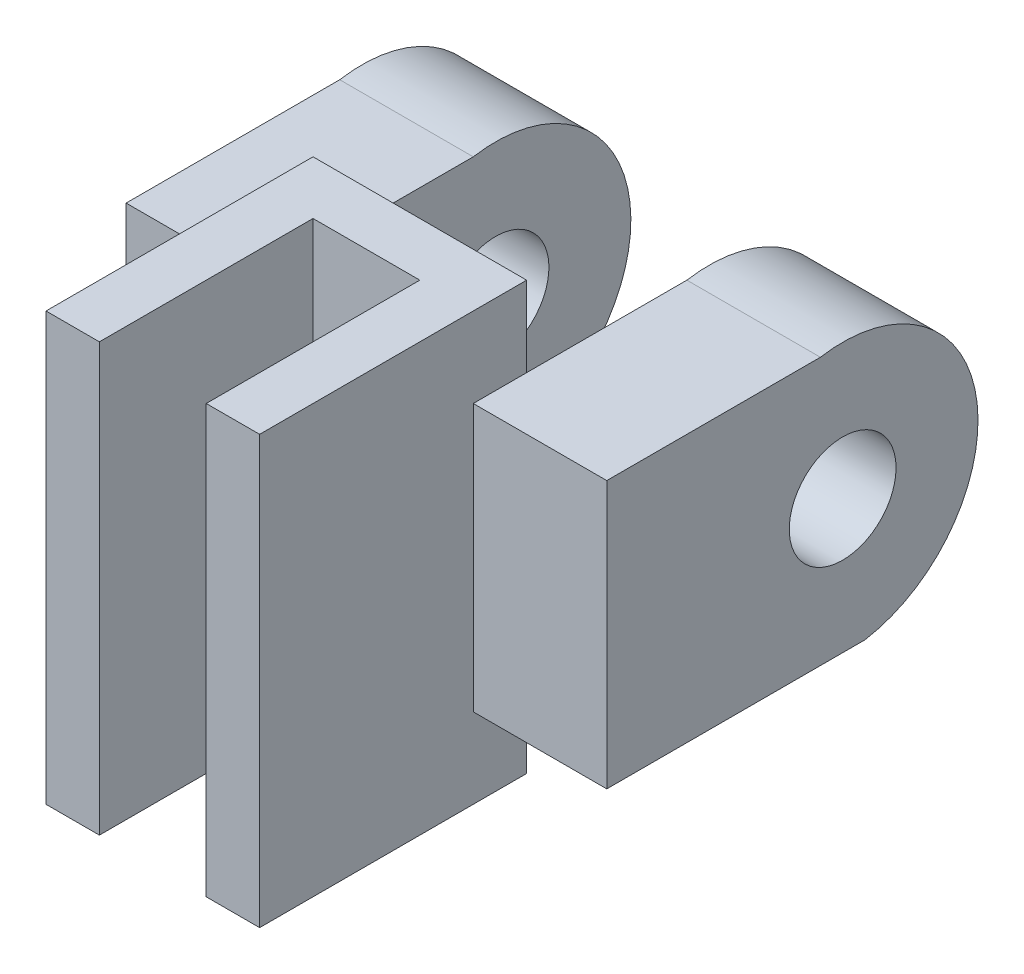
ISO-10303-21;
HEADER;
FILE_DESCRIPTION(('STEP AP214'),'2;1');
FILE_NAME('part.step','',(''),(''),'','','');
FILE_SCHEMA(('AUTOMOTIVE_DESIGN { 1 0 10303 214 1 1 1 1 }'));
ENDSEC;
DATA;
#1=APPLICATION_CONTEXT('core data for automotive mechanical design processes');
#2=APPLICATION_PROTOCOL_DEFINITION('international standard','automotive_design',2000,#1);
#3=PRODUCT_CONTEXT('',#1,'mechanical');
#4=PRODUCT('Part','Part','',(#3));
#5=PRODUCT_RELATED_PRODUCT_CATEGORY('part','',(#4));
#6=PRODUCT_DEFINITION_FORMATION('','',#4);
#7=PRODUCT_DEFINITION_CONTEXT('part definition',#1,'design');
#8=PRODUCT_DEFINITION('design','',#6,#7);
#9=PRODUCT_DEFINITION_SHAPE('','',#8);
#10=(LENGTH_UNIT() NAMED_UNIT(*) SI_UNIT(.MILLI.,.METRE.));
#11=(NAMED_UNIT(*) PLANE_ANGLE_UNIT() SI_UNIT($,.RADIAN.));
#12=(NAMED_UNIT(*) SI_UNIT($,.STERADIAN.) SOLID_ANGLE_UNIT());
#13=UNCERTAINTY_MEASURE_WITH_UNIT(LENGTH_MEASURE(1.E-05),#10,'distance_accuracy_value','');
#14=(GEOMETRIC_REPRESENTATION_CONTEXT(3) GLOBAL_UNCERTAINTY_ASSIGNED_CONTEXT((#13)) GLOBAL_UNIT_ASSIGNED_CONTEXT((#10,
#11,#12)) REPRESENTATION_CONTEXT('',''));
#15=CARTESIAN_POINT('',(0.,0.,0.));
#16=DIRECTION('',(0.,0.,1.));
#17=DIRECTION('',(1.,0.,0.));
#18=AXIS2_PLACEMENT_3D('',#15,#16,#17);
#19=CARTESIAN_POINT('',(2.,-2.5,3.));
#20=DIRECTION('',(0.,1.,0.));
#21=DIRECTION('',(-1.,0.,0.));
#22=AXIS2_PLACEMENT_3D('',#19,#20,#21);
#23=PLANE('',#22);
#24=DIRECTION('',(-1.,0.,0.));
#25=VECTOR('',#24,1.);
#26=CARTESIAN_POINT('',(4.5,-2.5,1.));
#27=LINE('',#26,#25);
#28=CARTESIAN_POINT('',(4.5,-2.5,1.));
#29=VERTEX_POINT('',#28);
#30=CARTESIAN_POINT('',(2.,-2.5,1.));
#31=VERTEX_POINT('',#30);
#32=EDGE_CURVE('E308',#29,#31,#27,.T.);
#33=ORIENTED_EDGE('',*,*,#32,.T.);
#34=DIRECTION('',(0.,0.,-1.));
#35=VECTOR('',#34,1.);
#36=CARTESIAN_POINT('',(2.,-2.5,3.));
#37=LINE('',#36,#35);
#38=CARTESIAN_POINT('',(2.,-2.5,0.));
#39=VERTEX_POINT('',#38);
#40=EDGE_CURVE('E242',#31,#39,#37,.T.);
#41=ORIENTED_EDGE('',*,*,#40,.T.);
#42=DIRECTION('',(0.,0.,1.));
#43=VECTOR('',#42,1.);
#44=CARTESIAN_POINT('',(2.,-2.5,0.));
#45=LINE('',#44,#43);
#46=CARTESIAN_POINT('',(2.,-2.5,-3.8334141689622));
#47=VERTEX_POINT('',#46);
#48=EDGE_CURVE('E245',#47,#39,#45,.T.);
#49=ORIENTED_EDGE('',*,*,#48,.F.);
#50=DIRECTION('',(1.,0.,0.));
#51=VECTOR('',#50,1.);
#52=CARTESIAN_POINT('',(0.999999999999999,-2.5,-3.8334141689622));
#53=LINE('',#52,#51);
#54=CARTESIAN_POINT('',(4.5,-2.5,-3.8334141689622));
#55=VERTEX_POINT('',#54);
#56=EDGE_CURVE('E260',#47,#55,#53,.T.);
#57=ORIENTED_EDGE('',*,*,#56,.T.);
#58=DIRECTION('',(0.,0.,1.));
#59=VECTOR('',#58,1.);
#60=CARTESIAN_POINT('',(4.5,-2.5,0.));
#61=LINE('',#60,#59);
#62=EDGE_CURVE('E293',#55,#29,#61,.T.);
#63=ORIENTED_EDGE('',*,*,#62,.T.);
#64=EDGE_LOOP('',(#33,#41,#49,#57,#63));
#65=FACE_BOUND('',#64,.T.);
#66=ADVANCED_FACE('F33',(#65),#23,.F.);
#67=CARTESIAN_POINT('',(2.,2.5,3.));
#68=DIRECTION('',(0.,-1.,0.));
#69=DIRECTION('',(0.,0.,-1.));
#70=AXIS2_PLACEMENT_3D('',#67,#68,#69);
#71=PLANE('',#70);
#72=DIRECTION('',(0.,0.,1.));
#73=VECTOR('',#72,1.);
#74=CARTESIAN_POINT('',(2.,2.5,3.));
#75=LINE('',#74,#73);
#76=CARTESIAN_POINT('',(2.,2.5,-3.));
#77=VERTEX_POINT('',#76);
#78=CARTESIAN_POINT('',(2.,2.5,0.));
#79=VERTEX_POINT('',#78);
#80=EDGE_CURVE('E252',#77,#79,#75,.T.);
#81=ORIENTED_EDGE('',*,*,#80,.T.);
#82=DIRECTION('',(0.,0.,1.));
#83=VECTOR('',#82,1.);
#84=CARTESIAN_POINT('',(2.,2.5,3.));
#85=LINE('',#84,#83);
#86=CARTESIAN_POINT('',(2.,2.5,0.999999999999999));
#87=VERTEX_POINT('',#86);
#88=EDGE_CURVE('E243',#79,#87,#85,.T.);
#89=ORIENTED_EDGE('',*,*,#88,.T.);
#90=DIRECTION('',(-1.,0.,0.));
#91=VECTOR('',#90,1.);
#92=CARTESIAN_POINT('',(4.5,2.5,1.));
#93=LINE('',#92,#91);
#94=CARTESIAN_POINT('',(4.5,2.5,1.));
#95=VERTEX_POINT('',#94);
#96=EDGE_CURVE('E300',#95,#87,#93,.T.);
#97=ORIENTED_EDGE('',*,*,#96,.F.);
#98=DIRECTION('',(0.,0.,1.));
#99=VECTOR('',#98,1.);
#100=CARTESIAN_POINT('',(4.5,2.5,0.));
#101=LINE('',#100,#99);
#102=CARTESIAN_POINT('',(4.5,2.5,-3.));
#103=VERTEX_POINT('',#102);
#104=EDGE_CURVE('E295',#103,#95,#101,.T.);
#105=ORIENTED_EDGE('',*,*,#104,.F.);
#106=DIRECTION('',(1.,0.,0.));
#107=VECTOR('',#106,1.);
#108=CARTESIAN_POINT('',(0.999999999999999,2.5,-3.));
#109=LINE('',#108,#107);
#110=EDGE_CURVE('E261',#77,#103,#109,.T.);
#111=ORIENTED_EDGE('',*,*,#110,.F.);
#112=EDGE_LOOP('',(#81,#89,#97,#105,#111));
#113=FACE_BOUND('',#112,.T.);
#114=ADVANCED_FACE('F371',(#113),#71,.F.);
#115=CARTESIAN_POINT('',(0.,0.,0.));
#116=DIRECTION('',(0.,0.,-1.));
#117=DIRECTION('',(-1.,0.,0.));
#118=AXIS2_PLACEMENT_3D('',#115,#116,#117);
#119=PLANE('',#118);
#120=DIRECTION('',(0.,-1.,0.));
#121=VECTOR('',#120,1.);
#122=CARTESIAN_POINT('',(-2.,2.5,0.));
#123=LINE('',#122,#121);
#124=CARTESIAN_POINT('',(-2.,2.5,0.));
#125=VERTEX_POINT('',#124);
#126=CARTESIAN_POINT('',(-2.,-2.5,0.));
#127=VERTEX_POINT('',#126);
#128=EDGE_CURVE('E273',#125,#127,#123,.T.);
#129=ORIENTED_EDGE('',*,*,#128,.F.);
#130=DIRECTION('',(0.,1.,0.));
#131=VECTOR('',#130,1.);
#132=CARTESIAN_POINT('',(-2.,-4.,0.));
#133=LINE('',#132,#131);
#134=CARTESIAN_POINT('',(-2.,4.,0.));
#135=VERTEX_POINT('',#134);
#136=EDGE_CURVE('E234',#125,#135,#133,.T.);
#137=ORIENTED_EDGE('',*,*,#136,.T.);
#138=DIRECTION('',(-1.,0.,0.));
#139=VECTOR('',#138,1.);
#140=CARTESIAN_POINT('',(2.,4.,0.));
#141=LINE('',#140,#139);
#142=CARTESIAN_POINT('',(2.,4.,0.));
#143=VERTEX_POINT('',#142);
#144=EDGE_CURVE('E208',#143,#135,#141,.T.);
#145=ORIENTED_EDGE('',*,*,#144,.F.);
#146=DIRECTION('',(0.,1.,0.));
#147=VECTOR('',#146,1.);
#148=CARTESIAN_POINT('',(2.,-4.,0.));
#149=LINE('',#148,#147);
#150=EDGE_CURVE('E231',#79,#143,#149,.T.);
#151=ORIENTED_EDGE('',*,*,#150,.F.);
#152=DIRECTION('',(0.,1.,0.));
#153=VECTOR('',#152,1.);
#154=CARTESIAN_POINT('',(2.,2.5,0.));
#155=LINE('',#154,#153);
#156=EDGE_CURVE('E48',#39,#79,#155,.T.);
#157=ORIENTED_EDGE('',*,*,#156,.F.);
#158=CARTESIAN_POINT('',(2.,-4.,0.));
#159=VERTEX_POINT('',#158);
#160=EDGE_CURVE('E235',#159,#39,#149,.T.);
#161=ORIENTED_EDGE('',*,*,#160,.F.);
#162=DIRECTION('',(-1.,0.,0.));
#163=VECTOR('',#162,1.);
#164=CARTESIAN_POINT('',(2.,-4.,0.));
#165=LINE('',#164,#163);
#166=CARTESIAN_POINT('',(-2.,-4.,0.));
#167=VERTEX_POINT('',#166);
#168=EDGE_CURVE('E173',#159,#167,#165,.T.);
#169=ORIENTED_EDGE('',*,*,#168,.T.);
#170=EDGE_CURVE('E168',#167,#127,#133,.T.);
#171=ORIENTED_EDGE('',*,*,#170,.T.);
#172=EDGE_LOOP('',(#129,#137,#145,#151,#157,#161,#169,#171));
#173=FACE_BOUND('',#172,.T.);
#174=ADVANCED_FACE('F332',(#173),#119,.T.);
#175=CARTESIAN_POINT('',(-2.,2.5,3.));
#176=DIRECTION('',(1.,0.,0.));
#177=DIRECTION('',(0.,1.,0.));
#178=AXIS2_PLACEMENT_3D('',#175,#176,#177);
#179=PLANE('',#178);
#180=DIRECTION('',(0.,0.,1.));
#181=VECTOR('',#180,1.);
#182=CARTESIAN_POINT('',(-2.,-4.,0.));
#183=LINE('',#182,#181);
#184=CARTESIAN_POINT('',(-2.,-4.,5.));
#185=VERTEX_POINT('',#184);
#186=EDGE_CURVE('E160',#167,#185,#183,.T.);
#187=ORIENTED_EDGE('',*,*,#186,.T.);
#188=DIRECTION('',(0.,-1.,0.));
#189=VECTOR('',#188,1.);
#190=CARTESIAN_POINT('',(-2.,4.,5.));
#191=LINE('',#190,#189);
#192=CARTESIAN_POINT('',(-2.,4.,5.));
#193=VERTEX_POINT('',#192);
#194=EDGE_CURVE('E165',#193,#185,#191,.T.);
#195=ORIENTED_EDGE('',*,*,#194,.F.);
#196=DIRECTION('',(0.,0.,1.));
#197=VECTOR('',#196,1.);
#198=CARTESIAN_POINT('',(-2.,4.,0.));
#199=LINE('',#198,#197);
#200=EDGE_CURVE('E211',#135,#193,#199,.T.);
#201=ORIENTED_EDGE('',*,*,#200,.F.);
#202=ORIENTED_EDGE('',*,*,#136,.F.);
#203=DIRECTION('',(0.,0.,-1.));
#204=VECTOR('',#203,1.);
#205=CARTESIAN_POINT('',(-2.,2.5,3.));
#206=LINE('',#205,#204);
#207=CARTESIAN_POINT('',(-2.,2.5,0.999999999999999));
#208=VERTEX_POINT('',#207);
#209=EDGE_CURVE('E233',#208,#125,#206,.T.);
#210=ORIENTED_EDGE('',*,*,#209,.F.);
#211=DIRECTION('',(0.,-1.,0.));
#212=VECTOR('',#211,1.);
#213=CARTESIAN_POINT('',(-2.,2.5,0.999999999999999));
#214=LINE('',#213,#212);
#215=CARTESIAN_POINT('',(-2.,-2.5,0.999999999999999));
#216=VERTEX_POINT('',#215);
#217=EDGE_CURVE('E316',#208,#216,#214,.T.);
#218=ORIENTED_EDGE('',*,*,#217,.T.);
#219=DIRECTION('',(0.,0.,1.));
#220=VECTOR('',#219,1.);
#221=CARTESIAN_POINT('',(-2.,-2.5,3.));
#222=LINE('',#221,#220);
#223=EDGE_CURVE('E240',#127,#216,#222,.T.);
#224=ORIENTED_EDGE('',*,*,#223,.F.);
#225=ORIENTED_EDGE('',*,*,#170,.F.);
#226=EDGE_LOOP('',(#187,#195,#201,#202,#210,#218,#224,#225));
#227=FACE_BOUND('',#226,.T.);
#228=ADVANCED_FACE('F162',(#227),#179,.F.);
#229=DIRECTION('',(0.,0.,-1.));
#230=VECTOR('',#229,1.);
#231=CARTESIAN_POINT('',(-2.,-2.5,0.));
#232=LINE('',#231,#230);
#233=CARTESIAN_POINT('',(-2.,-2.5,-3.8334141689622));
#234=VERTEX_POINT('',#233);
#235=EDGE_CURVE('E290',#127,#234,#232,.T.);
#236=ORIENTED_EDGE('',*,*,#235,.F.);
#237=ORIENTED_EDGE('',*,*,#223,.T.);
#238=CARTESIAN_POINT('',(-4.5,-2.5,0.999999999999999));
#239=VERTEX_POINT('',#238);
#240=EDGE_CURVE('E307',#216,#239,#27,.T.);
#241=ORIENTED_EDGE('',*,*,#240,.T.);
#242=DIRECTION('',(0.,0.,-1.));
#243=VECTOR('',#242,1.);
#244=CARTESIAN_POINT('',(-4.5,-2.5,0.));
#245=LINE('',#244,#243);
#246=CARTESIAN_POINT('',(-4.5,-2.5,-3.8334141689622));
#247=VERTEX_POINT('',#246);
#248=EDGE_CURVE('E299',#239,#247,#245,.T.);
#249=ORIENTED_EDGE('',*,*,#248,.T.);
#250=DIRECTION('',(-1.,0.,0.));
#251=VECTOR('',#250,1.);
#252=CARTESIAN_POINT('',(-0.999999999999999,-2.5,-3.8334141689622));
#253=LINE('',#252,#251);
#254=EDGE_CURVE('E279',#234,#247,#253,.T.);
#255=ORIENTED_EDGE('',*,*,#254,.F.);
#256=EDGE_LOOP('',(#236,#237,#241,#249,#255));
#257=FACE_BOUND('',#256,.T.);
#258=ADVANCED_FACE('F35',(#257),#23,.F.);
#259=CARTESIAN_POINT('',(2.,2.5,3.));
#260=DIRECTION('',(-1.,0.,0.));
#261=DIRECTION('',(0.,0.,1.));
#262=AXIS2_PLACEMENT_3D('',#259,#260,#261);
#263=PLANE('',#262);
#264=DIRECTION('',(0.,0.,-1.));
#265=VECTOR('',#264,1.);
#266=CARTESIAN_POINT('',(2.,4.,0.));
#267=LINE('',#266,#265);
#268=CARTESIAN_POINT('',(2.,4.,5.));
#269=VERTEX_POINT('',#268);
#270=EDGE_CURVE('E205',#269,#143,#267,.T.);
#271=ORIENTED_EDGE('',*,*,#270,.F.);
#272=DIRECTION('',(0.,1.,0.));
#273=VECTOR('',#272,1.);
#274=CARTESIAN_POINT('',(2.,-4.,5.));
#275=LINE('',#274,#273);
#276=CARTESIAN_POINT('',(2.,-4.,5.));
#277=VERTEX_POINT('',#276);
#278=EDGE_CURVE('E199',#277,#269,#275,.T.);
#279=ORIENTED_EDGE('',*,*,#278,.F.);
#280=DIRECTION('',(0.,0.,-1.));
#281=VECTOR('',#280,1.);
#282=CARTESIAN_POINT('',(2.,-4.,0.));
#283=LINE('',#282,#281);
#284=EDGE_CURVE('E221',#277,#159,#283,.T.);
#285=ORIENTED_EDGE('',*,*,#284,.T.);
#286=ORIENTED_EDGE('',*,*,#160,.T.);
#287=ORIENTED_EDGE('',*,*,#40,.F.);
#288=DIRECTION('',(0.,1.,0.));
#289=VECTOR('',#288,1.);
#290=CARTESIAN_POINT('',(2.,2.5,1.));
#291=LINE('',#290,#289);
#292=EDGE_CURVE('E56',#31,#87,#291,.T.);
#293=ORIENTED_EDGE('',*,*,#292,.T.);
#294=ORIENTED_EDGE('',*,*,#88,.F.);
#295=ORIENTED_EDGE('',*,*,#150,.T.);
#296=EDGE_LOOP('',(#271,#279,#285,#286,#287,#293,#294,#295));
#297=FACE_BOUND('',#296,.T.);
#298=ADVANCED_FACE('F378',(#297),#263,.F.);
#299=CARTESIAN_POINT('',(-4.5,2.5,0.999999999999999));
#300=VERTEX_POINT('',#299);
#301=EDGE_CURVE('E298',#208,#300,#93,.T.);
#302=ORIENTED_EDGE('',*,*,#301,.F.);
#303=ORIENTED_EDGE('',*,*,#209,.T.);
#304=DIRECTION('',(0.,0.,-1.));
#305=VECTOR('',#304,1.);
#306=CARTESIAN_POINT('',(-2.,2.5,3.));
#307=LINE('',#306,#305);
#308=CARTESIAN_POINT('',(-2.,2.5,-3.));
#309=VERTEX_POINT('',#308);
#310=EDGE_CURVE('E278',#125,#309,#307,.T.);
#311=ORIENTED_EDGE('',*,*,#310,.T.);
#312=DIRECTION('',(-1.,0.,0.));
#313=VECTOR('',#312,1.);
#314=CARTESIAN_POINT('',(-0.999999999999999,2.5,-3.));
#315=LINE('',#314,#313);
#316=CARTESIAN_POINT('',(-4.5,2.5,-3.));
#317=VERTEX_POINT('',#316);
#318=EDGE_CURVE('E275',#309,#317,#315,.T.);
#319=ORIENTED_EDGE('',*,*,#318,.T.);
#320=DIRECTION('',(0.,0.,-1.));
#321=VECTOR('',#320,1.);
#322=CARTESIAN_POINT('',(-4.5,2.5,0.));
#323=LINE('',#322,#321);
#324=EDGE_CURVE('E302',#300,#317,#323,.T.);
#325=ORIENTED_EDGE('',*,*,#324,.F.);
#326=EDGE_LOOP('',(#302,#303,#311,#319,#325));
#327=FACE_BOUND('',#326,.T.);
#328=ADVANCED_FACE('F338',(#327),#71,.F.);
#329=CARTESIAN_POINT('',(-1.,2.5,1.));
#330=DIRECTION('',(-1.,0.,0.));
#331=DIRECTION('',(0.,0.,1.));
#332=AXIS2_PLACEMENT_3D('',#329,#330,#331);
#333=PLANE('',#332);
#334=DIRECTION('',(0.,0.,-1.));
#335=VECTOR('',#334,1.);
#336=CARTESIAN_POINT('',(-1.,4.,3.));
#337=LINE('',#336,#335);
#338=CARTESIAN_POINT('',(-1.,4.,5.));
#339=VERTEX_POINT('',#338);
#340=CARTESIAN_POINT('',(-1.,4.,1.));
#341=VERTEX_POINT('',#340);
#342=EDGE_CURVE('E213',#339,#341,#337,.T.);
#343=ORIENTED_EDGE('',*,*,#342,.F.);
#344=DIRECTION('',(0.,1.,0.));
#345=VECTOR('',#344,1.);
#346=CARTESIAN_POINT('',(-1.,4.,5.));
#347=LINE('',#346,#345);
#348=CARTESIAN_POINT('',(-1.,-4.,5.));
#349=VERTEX_POINT('',#348);
#350=EDGE_CURVE('E183',#349,#339,#347,.T.);
#351=ORIENTED_EDGE('',*,*,#350,.F.);
#352=DIRECTION('',(0.,0.,-1.));
#353=VECTOR('',#352,1.);
#354=CARTESIAN_POINT('',(-1.,-4.,3.));
#355=LINE('',#354,#353);
#356=CARTESIAN_POINT('',(-1.,-4.,1.));
#357=VERTEX_POINT('',#356);
#358=EDGE_CURVE('E172',#349,#357,#355,.T.);
#359=ORIENTED_EDGE('',*,*,#358,.T.);
#360=DIRECTION('',(0.,-1.,0.));
#361=VECTOR('',#360,1.);
#362=CARTESIAN_POINT('',(-1.,2.5,1.));
#363=LINE('',#362,#361);
#364=EDGE_CURVE('E37',#341,#357,#363,.T.);
#365=ORIENTED_EDGE('',*,*,#364,.F.);
#366=EDGE_LOOP('',(#343,#351,#359,#365));
#367=FACE_BOUND('',#366,.T.);
#368=ADVANCED_FACE('F325',(#367),#333,.F.);
#369=CARTESIAN_POINT('',(1.,2.5,1.));
#370=DIRECTION('',(1.,0.,0.));
#371=DIRECTION('',(0.,0.,-1.));
#372=AXIS2_PLACEMENT_3D('',#369,#370,#371);
#373=PLANE('',#372);
#374=DIRECTION('',(0.,0.,1.));
#375=VECTOR('',#374,1.);
#376=CARTESIAN_POINT('',(1.,-4.,1.));
#377=LINE('',#376,#375);
#378=CARTESIAN_POINT('',(1.,-4.,1.));
#379=VERTEX_POINT('',#378);
#380=CARTESIAN_POINT('',(1.,-4.,5.));
#381=VERTEX_POINT('',#380);
#382=EDGE_CURVE('E229',#379,#381,#377,.T.);
#383=ORIENTED_EDGE('',*,*,#382,.T.);
#384=DIRECTION('',(0.,-1.,0.));
#385=VECTOR('',#384,1.);
#386=CARTESIAN_POINT('',(1.,-4.,5.));
#387=LINE('',#386,#385);
#388=CARTESIAN_POINT('',(1.,4.,5.));
#389=VERTEX_POINT('',#388);
#390=EDGE_CURVE('E193',#389,#381,#387,.T.);
#391=ORIENTED_EDGE('',*,*,#390,.F.);
#392=DIRECTION('',(0.,0.,1.));
#393=VECTOR('',#392,1.);
#394=CARTESIAN_POINT('',(1.,4.,1.));
#395=LINE('',#394,#393);
#396=CARTESIAN_POINT('',(1.,4.,1.));
#397=VERTEX_POINT('',#396);
#398=EDGE_CURVE('E219',#397,#389,#395,.T.);
#399=ORIENTED_EDGE('',*,*,#398,.F.);
#400=DIRECTION('',(0.,1.,0.));
#401=VECTOR('',#400,1.);
#402=CARTESIAN_POINT('',(1.,2.5,1.));
#403=LINE('',#402,#401);
#404=EDGE_CURVE('E11',#379,#397,#403,.T.);
#405=ORIENTED_EDGE('',*,*,#404,.F.);
#406=EDGE_LOOP('',(#383,#391,#399,#405));
#407=FACE_BOUND('',#406,.T.);
#408=ADVANCED_FACE('F396',(#407),#373,.F.);
#409=CARTESIAN_POINT('',(0.,0.,1.));
#410=DIRECTION('',(0.,0.,-1.));
#411=DIRECTION('',(-1.,0.,0.));
#412=AXIS2_PLACEMENT_3D('',#409,#410,#411);
#413=PLANE('',#412);
#414=ORIENTED_EDGE('',*,*,#364,.T.);
#415=DIRECTION('',(1.,0.,0.));
#416=VECTOR('',#415,1.);
#417=CARTESIAN_POINT('',(-1.,-4.,1.));
#418=LINE('',#417,#416);
#419=EDGE_CURVE('E226',#357,#379,#418,.T.);
#420=ORIENTED_EDGE('',*,*,#419,.T.);
#421=ORIENTED_EDGE('',*,*,#404,.T.);
#422=DIRECTION('',(1.,0.,0.));
#423=VECTOR('',#422,1.);
#424=CARTESIAN_POINT('',(-1.,4.,1.));
#425=LINE('',#424,#423);
#426=EDGE_CURVE('E216',#341,#397,#425,.T.);
#427=ORIENTED_EDGE('',*,*,#426,.F.);
#428=EDGE_LOOP('',(#414,#420,#421,#427));
#429=FACE_BOUND('',#428,.T.);
#430=ADVANCED_FACE('F321',(#429),#413,.F.);
#431=CARTESIAN_POINT('',(4.5,2.5,0.));
#432=DIRECTION('',(1.,0.,0.));
#433=DIRECTION('',(0.,1.,0.));
#434=AXIS2_PLACEMENT_3D('',#431,#432,#433);
#435=PLANE('',#434);
#436=ORIENTED_EDGE('',*,*,#62,.F.);
#437=CARTESIAN_POINT('',(4.5,0.,-3.4167070844811));
#438=DIRECTION('',(1.,0.,0.));
#439=DIRECTION('',(0.,0.,1.));
#440=AXIS2_PLACEMENT_3D('',#437,#438,#439);
#441=CIRCLE('',#440,2.53449103258558);
#442=EDGE_CURVE('E257',#55,#103,#441,.T.);
#443=ORIENTED_EDGE('',*,*,#442,.T.);
#444=ORIENTED_EDGE('',*,*,#104,.T.);
#445=DIRECTION('',(0.,-1.,0.));
#446=VECTOR('',#445,1.);
#447=CARTESIAN_POINT('',(4.5,2.5,1.));
#448=LINE('',#447,#446);
#449=EDGE_CURVE('E304',#95,#29,#448,.T.);
#450=ORIENTED_EDGE('',*,*,#449,.T.);
#451=EDGE_LOOP('',(#436,#443,#444,#450));
#452=FACE_BOUND('',#451,.T.);
#453=CARTESIAN_POINT('',(4.5,0.,-3.4167070844811));
#454=DIRECTION('',(1.,0.,0.));
#455=DIRECTION('',(0.,0.,-1.));
#456=AXIS2_PLACEMENT_3D('',#453,#454,#455);
#457=CIRCLE('',#456,1.);
#458=CARTESIAN_POINT('',(4.5,0.,-4.4167070844811));
#459=VERTEX_POINT('',#458);
#460=EDGE_CURVE('E254',#459,#459,#457,.T.);
#461=ORIENTED_EDGE('',*,*,#460,.F.);
#462=EDGE_LOOP('',(#461));
#463=FACE_BOUND('',#462,.T.);
#464=ADVANCED_FACE('F391',(#452,#463),#435,.T.);
#465=CARTESIAN_POINT('',(4.5,2.5,1.));
#466=DIRECTION('',(0.,0.,1.));
#467=DIRECTION('',(1.,0.,0.));
#468=AXIS2_PLACEMENT_3D('',#465,#466,#467);
#469=PLANE('',#468);
#470=ORIENTED_EDGE('',*,*,#292,.F.);
#471=ORIENTED_EDGE('',*,*,#32,.F.);
#472=ORIENTED_EDGE('',*,*,#449,.F.);
#473=ORIENTED_EDGE('',*,*,#96,.T.);
#474=EDGE_LOOP('',(#470,#471,#472,#473));
#475=FACE_BOUND('',#474,.T.);
#476=ADVANCED_FACE('F426',(#475),#469,.T.);
#477=ORIENTED_EDGE('',*,*,#217,.F.);
#478=ORIENTED_EDGE('',*,*,#301,.T.);
#479=DIRECTION('',(0.,-1.,0.));
#480=VECTOR('',#479,1.);
#481=CARTESIAN_POINT('',(-4.5,2.5,0.999999999999999));
#482=LINE('',#481,#480);
#483=EDGE_CURVE('E311',#300,#239,#482,.T.);
#484=ORIENTED_EDGE('',*,*,#483,.T.);
#485=ORIENTED_EDGE('',*,*,#240,.F.);
#486=EDGE_LOOP('',(#477,#478,#484,#485));
#487=FACE_BOUND('',#486,.T.);
#488=ADVANCED_FACE('F343',(#487),#469,.T.);
#489=CARTESIAN_POINT('',(-4.5,2.5,0.));
#490=DIRECTION('',(-1.,0.,0.));
#491=DIRECTION('',(0.,-1.,0.));
#492=AXIS2_PLACEMENT_3D('',#489,#490,#491);
#493=PLANE('',#492);
#494=ORIENTED_EDGE('',*,*,#248,.F.);
#495=ORIENTED_EDGE('',*,*,#483,.F.);
#496=ORIENTED_EDGE('',*,*,#324,.T.);
#497=CARTESIAN_POINT('',(-4.5,0.,-3.4167070844811));
#498=DIRECTION('',(1.,0.,0.));
#499=DIRECTION('',(0.,0.,1.));
#500=AXIS2_PLACEMENT_3D('',#497,#498,#499);
#501=CIRCLE('',#500,2.53449103258558);
#502=EDGE_CURVE('E282',#247,#317,#501,.T.);
#503=ORIENTED_EDGE('',*,*,#502,.F.);
#504=EDGE_LOOP('',(#494,#495,#496,#503));
#505=FACE_BOUND('',#504,.T.);
#506=CARTESIAN_POINT('',(-4.5,0.,-3.4167070844811));
#507=DIRECTION('',(1.,0.,0.));
#508=DIRECTION('',(0.,0.,-1.));
#509=AXIS2_PLACEMENT_3D('',#506,#507,#508);
#510=CIRCLE('',#509,1.);
#511=CARTESIAN_POINT('',(-4.5,0.,-4.4167070844811));
#512=VERTEX_POINT('',#511);
#513=EDGE_CURVE('E274',#512,#512,#510,.T.);
#514=ORIENTED_EDGE('',*,*,#513,.T.);
#515=EDGE_LOOP('',(#514));
#516=FACE_BOUND('',#515,.T.);
#517=ADVANCED_FACE('F347',(#505,#516),#493,.T.);
#518=CARTESIAN_POINT('',(-0.999999999999999,0.,-3.4167070844811));
#519=DIRECTION('',(-1.,0.,0.));
#520=DIRECTION('',(0.,0.,1.));
#521=AXIS2_PLACEMENT_3D('',#518,#519,#520);
#522=CYLINDRICAL_SURFACE('',#521,2.53449103258558);
#523=ORIENTED_EDGE('',*,*,#318,.F.);
#524=CARTESIAN_POINT('',(-2.,0.,-3.4167070844811));
#525=DIRECTION('',(-1.,0.,0.));
#526=DIRECTION('',(0.,-1.,0.));
#527=AXIS2_PLACEMENT_3D('',#524,#525,#526);
#528=CIRCLE('',#527,2.53449103258558);
#529=EDGE_CURVE('E267',#309,#234,#528,.T.);
#530=ORIENTED_EDGE('',*,*,#529,.T.);
#531=ORIENTED_EDGE('',*,*,#254,.T.);
#532=ORIENTED_EDGE('',*,*,#502,.T.);
#533=EDGE_LOOP('',(#523,#530,#531,#532));
#534=FACE_BOUND('',#533,.T.);
#535=ADVANCED_FACE('F353',(#534),#522,.T.);
#536=CARTESIAN_POINT('',(-0.999999999999999,0.,-3.4167070844811));
#537=DIRECTION('',(-1.,0.,0.));
#538=DIRECTION('',(0.,0.,1.));
#539=AXIS2_PLACEMENT_3D('',#536,#537,#538);
#540=CYLINDRICAL_SURFACE('',#539,1.);
#541=CARTESIAN_POINT('',(-2.,0.,-3.4167070844811));
#542=DIRECTION('',(-1.,0.,0.));
#543=DIRECTION('',(0.,-1.,0.));
#544=AXIS2_PLACEMENT_3D('',#541,#542,#543);
#545=CIRCLE('',#544,1.);
#546=CARTESIAN_POINT('',(-2.,-1.,-3.4167070844811));
#547=VERTEX_POINT('',#546);
#548=EDGE_CURVE('E270',#547,#547,#545,.T.);
#549=ORIENTED_EDGE('',*,*,#548,.F.);
#550=EDGE_LOOP('',(#549));
#551=FACE_BOUND('',#550,.T.);
#552=ORIENTED_EDGE('',*,*,#513,.F.);
#553=EDGE_LOOP('',(#552));
#554=FACE_BOUND('',#553,.T.);
#555=ADVANCED_FACE('F357',(#551,#554),#540,.F.);
#556=CARTESIAN_POINT('',(-2.,2.53449103258558,0.));
#557=DIRECTION('',(-1.,0.,0.));
#558=DIRECTION('',(0.,-1.,0.));
#559=AXIS2_PLACEMENT_3D('',#556,#557,#558);
#560=PLANE('',#559);
#561=ORIENTED_EDGE('',*,*,#548,.T.);
#562=EDGE_LOOP('',(#561));
#563=FACE_BOUND('',#562,.T.);
#564=ORIENTED_EDGE('',*,*,#128,.T.);
#565=ORIENTED_EDGE('',*,*,#235,.T.);
#566=ORIENTED_EDGE('',*,*,#529,.F.);
#567=ORIENTED_EDGE('',*,*,#310,.F.);
#568=EDGE_LOOP('',(#564,#565,#566,#567));
#569=FACE_BOUND('',#568,.T.);
#570=ADVANCED_FACE('F354',(#563,#569),#560,.F.);
#571=CARTESIAN_POINT('',(0.999999999999999,0.,-3.4167070844811));
#572=DIRECTION('',(1.,0.,0.));
#573=DIRECTION('',(0.,0.,-1.));
#574=AXIS2_PLACEMENT_3D('',#571,#572,#573);
#575=CYLINDRICAL_SURFACE('',#574,2.53449103258558);
#576=CARTESIAN_POINT('',(2.,0.,-3.4167070844811));
#577=DIRECTION('',(1.,0.,0.));
#578=DIRECTION('',(0.,0.,-1.));
#579=AXIS2_PLACEMENT_3D('',#576,#577,#578);
#580=CIRCLE('',#579,2.53449103258558);
#581=EDGE_CURVE('E250',#77,#47,#580,.F.);
#582=ORIENTED_EDGE('',*,*,#581,.F.);
#583=ORIENTED_EDGE('',*,*,#110,.T.);
#584=ORIENTED_EDGE('',*,*,#442,.F.);
#585=ORIENTED_EDGE('',*,*,#56,.F.);
#586=EDGE_LOOP('',(#582,#583,#584,#585));
#587=FACE_BOUND('',#586,.T.);
#588=ADVANCED_FACE('F356',(#587),#575,.T.);
#589=CARTESIAN_POINT('',(0.999999999999999,0.,-3.4167070844811));
#590=DIRECTION('',(1.,0.,0.));
#591=DIRECTION('',(0.,0.,-1.));
#592=AXIS2_PLACEMENT_3D('',#589,#590,#591);
#593=CYLINDRICAL_SURFACE('',#592,1.);
#594=CARTESIAN_POINT('',(2.,0.,-3.4167070844811));
#595=DIRECTION('',(1.,0.,0.));
#596=DIRECTION('',(0.,0.,-1.));
#597=AXIS2_PLACEMENT_3D('',#594,#595,#596);
#598=CIRCLE('',#597,1.);
#599=CARTESIAN_POINT('',(2.,0.,-4.4167070844811));
#600=VERTEX_POINT('',#599);
#601=EDGE_CURVE('E249',#600,#600,#598,.F.);
#602=ORIENTED_EDGE('',*,*,#601,.T.);
#603=EDGE_LOOP('',(#602));
#604=FACE_BOUND('',#603,.T.);
#605=ORIENTED_EDGE('',*,*,#460,.T.);
#606=EDGE_LOOP('',(#605));
#607=FACE_BOUND('',#606,.T.);
#608=ADVANCED_FACE('F364',(#604,#607),#593,.F.);
#609=CARTESIAN_POINT('',(2.,2.53449103258558,0.));
#610=DIRECTION('',(1.,0.,0.));
#611=DIRECTION('',(0.,0.,-1.));
#612=AXIS2_PLACEMENT_3D('',#609,#610,#611);
#613=PLANE('',#612);
#614=ORIENTED_EDGE('',*,*,#601,.F.);
#615=EDGE_LOOP('',(#614));
#616=FACE_BOUND('',#615,.T.);
#617=ORIENTED_EDGE('',*,*,#80,.F.);
#618=ORIENTED_EDGE('',*,*,#581,.T.);
#619=ORIENTED_EDGE('',*,*,#48,.T.);
#620=ORIENTED_EDGE('',*,*,#156,.T.);
#621=EDGE_LOOP('',(#617,#618,#619,#620));
#622=FACE_BOUND('',#621,.T.);
#623=ADVANCED_FACE('F467',(#616,#622),#613,.F.);
#624=CARTESIAN_POINT('',(0.,4.,0.));
#625=DIRECTION('',(0.,-1.,0.));
#626=DIRECTION('',(0.,0.,-1.));
#627=AXIS2_PLACEMENT_3D('',#624,#625,#626);
#628=PLANE('',#627);
#629=ORIENTED_EDGE('',*,*,#270,.T.);
#630=ORIENTED_EDGE('',*,*,#144,.T.);
#631=ORIENTED_EDGE('',*,*,#200,.T.);
#632=DIRECTION('',(-1.,0.,0.));
#633=VECTOR('',#632,1.);
#634=CARTESIAN_POINT('',(-2.,4.,5.));
#635=LINE('',#634,#633);
#636=EDGE_CURVE('E188',#339,#193,#635,.T.);
#637=ORIENTED_EDGE('',*,*,#636,.F.);
#638=ORIENTED_EDGE('',*,*,#342,.T.);
#639=ORIENTED_EDGE('',*,*,#426,.T.);
#640=ORIENTED_EDGE('',*,*,#398,.T.);
#641=DIRECTION('',(-1.,0.,0.));
#642=VECTOR('',#641,1.);
#643=CARTESIAN_POINT('',(1.,4.,5.));
#644=LINE('',#643,#642);
#645=EDGE_CURVE('E202',#269,#389,#644,.T.);
#646=ORIENTED_EDGE('',*,*,#645,.F.);
#647=EDGE_LOOP('',(#629,#630,#631,#637,#638,#639,#640,#646));
#648=FACE_BOUND('',#647,.T.);
#649=ADVANCED_FACE('F327',(#648),#628,.F.);
#650=CARTESIAN_POINT('',(0.,-4.,0.));
#651=DIRECTION('',(0.,-1.,0.));
#652=DIRECTION('',(0.,0.,-1.));
#653=AXIS2_PLACEMENT_3D('',#650,#651,#652);
#654=PLANE('',#653);
#655=ORIENTED_EDGE('',*,*,#284,.F.);
#656=DIRECTION('',(1.,0.,0.));
#657=VECTOR('',#656,1.);
#658=CARTESIAN_POINT('',(1.,-4.,5.));
#659=LINE('',#658,#657);
#660=EDGE_CURVE('E196',#381,#277,#659,.T.);
#661=ORIENTED_EDGE('',*,*,#660,.F.);
#662=ORIENTED_EDGE('',*,*,#382,.F.);
#663=ORIENTED_EDGE('',*,*,#419,.F.);
#664=ORIENTED_EDGE('',*,*,#358,.F.);
#665=DIRECTION('',(1.,0.,0.));
#666=VECTOR('',#665,1.);
#667=CARTESIAN_POINT('',(-2.,-4.,5.));
#668=LINE('',#667,#666);
#669=EDGE_CURVE('E176',#185,#349,#668,.T.);
#670=ORIENTED_EDGE('',*,*,#669,.F.);
#671=ORIENTED_EDGE('',*,*,#186,.F.);
#672=ORIENTED_EDGE('',*,*,#168,.F.);
#673=EDGE_LOOP('',(#655,#661,#662,#663,#664,#670,#671,#672));
#674=FACE_BOUND('',#673,.T.);
#675=ADVANCED_FACE('F177',(#674),#654,.T.);
#676=CARTESIAN_POINT('',(0.,0.,5.));
#677=DIRECTION('',(0.,0.,-1.));
#678=DIRECTION('',(-1.,0.,0.));
#679=AXIS2_PLACEMENT_3D('',#676,#677,#678);
#680=PLANE('',#679);
#681=ORIENTED_EDGE('',*,*,#390,.T.);
#682=ORIENTED_EDGE('',*,*,#660,.T.);
#683=ORIENTED_EDGE('',*,*,#278,.T.);
#684=ORIENTED_EDGE('',*,*,#645,.T.);
#685=EDGE_LOOP('',(#681,#682,#683,#684));
#686=FACE_BOUND('',#685,.T.);
#687=ADVANCED_FACE('F593',(#686),#680,.F.);
#688=CARTESIAN_POINT('',(0.,0.,5.));
#689=DIRECTION('',(0.,0.,1.));
#690=DIRECTION('',(1.,0.,0.));
#691=AXIS2_PLACEMENT_3D('',#688,#689,#690);
#692=PLANE('',#691);
#693=ORIENTED_EDGE('',*,*,#194,.T.);
#694=ORIENTED_EDGE('',*,*,#669,.T.);
#695=ORIENTED_EDGE('',*,*,#350,.T.);
#696=ORIENTED_EDGE('',*,*,#636,.T.);
#697=EDGE_LOOP('',(#693,#694,#695,#696));
#698=FACE_BOUND('',#697,.T.);
#699=ADVANCED_FACE('F186',(#698),#692,.T.);
#700=CLOSED_SHELL('',(#66,#114,#174,#228,#258,#298,#328,#368,#408,#430,#464,#476,#488,#517,#535,
#555,#570,#588,#608,#623,#649,#675,#687,#699));
#701=MANIFOLD_SOLID_BREP('B2',#700);
#702=ADVANCED_BREP_SHAPE_REPRESENTATION('',(#18,#701),#14);
#703=SHAPE_DEFINITION_REPRESENTATION(#9,#702);
ENDSEC;
END-ISO-10303-21;
